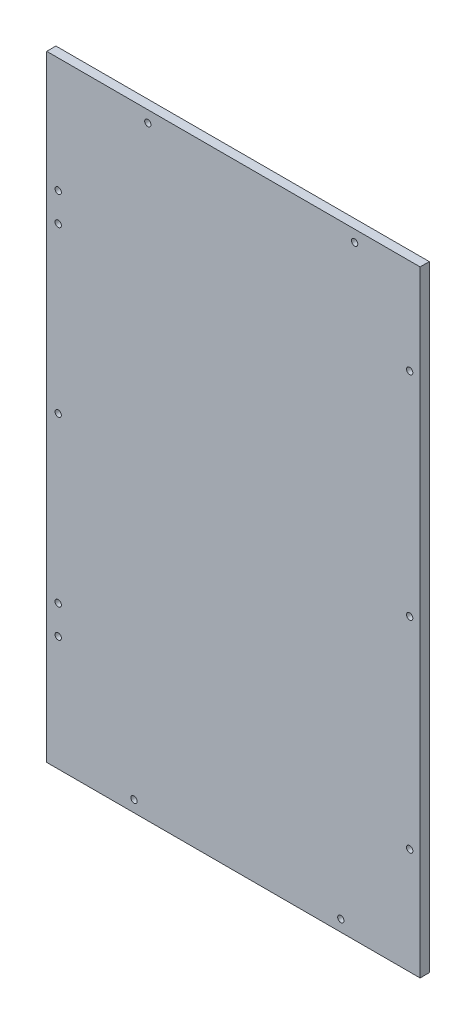
ISO-10303-21;
HEADER;
FILE_DESCRIPTION(('STEP AP214'),'2;1');
FILE_NAME('part.step','',(''),(''),'','','');
FILE_SCHEMA(('AUTOMOTIVE_DESIGN { 1 0 10303 214 1 1 1 1 }'));
ENDSEC;
DATA;
#1=APPLICATION_CONTEXT('core data for automotive mechanical design processes');
#2=APPLICATION_PROTOCOL_DEFINITION('international standard','automotive_design',2000,#1);
#3=PRODUCT_CONTEXT('',#1,'mechanical');
#4=PRODUCT('Part','Part','',(#3));
#5=PRODUCT_RELATED_PRODUCT_CATEGORY('part','',(#4));
#6=PRODUCT_DEFINITION_FORMATION('','',#4);
#7=PRODUCT_DEFINITION_CONTEXT('part definition',#1,'design');
#8=PRODUCT_DEFINITION('design','',#6,#7);
#9=PRODUCT_DEFINITION_SHAPE('','',#8);
#10=(LENGTH_UNIT() NAMED_UNIT(*) SI_UNIT(.MILLI.,.METRE.));
#11=(NAMED_UNIT(*) PLANE_ANGLE_UNIT() SI_UNIT($,.RADIAN.));
#12=(NAMED_UNIT(*) SI_UNIT($,.STERADIAN.) SOLID_ANGLE_UNIT());
#13=UNCERTAINTY_MEASURE_WITH_UNIT(LENGTH_MEASURE(1.E-05),#10,'distance_accuracy_value','');
#14=(GEOMETRIC_REPRESENTATION_CONTEXT(3) GLOBAL_UNCERTAINTY_ASSIGNED_CONTEXT((#13)) GLOBAL_UNIT_ASSIGNED_CONTEXT((#10,
#11,#12)) REPRESENTATION_CONTEXT('',''));
#15=CARTESIAN_POINT('',(0.,0.,0.));
#16=DIRECTION('',(0.,0.,1.));
#17=DIRECTION('',(1.,0.,0.));
#18=AXIS2_PLACEMENT_3D('',#15,#16,#17);
#19=CARTESIAN_POINT('',(0.,0.,8.));
#20=DIRECTION('',(0.,0.,1.));
#21=DIRECTION('',(1.,0.,0.));
#22=AXIS2_PLACEMENT_3D('',#19,#20,#21);
#23=PLANE('',#22);
#24=CARTESIAN_POINT('',(-257.999921927843,168.009529996844,8.));
#25=DIRECTION('',(0.,0.,1.));
#26=DIRECTION('',(1.,0.,0.));
#27=AXIS2_PLACEMENT_3D('',#24,#25,#26);
#28=CIRCLE('',#27,2.74999999999998);
#29=CARTESIAN_POINT('',(-255.249921927843,168.009529996844,8.));
#30=VERTEX_POINT('',#29);
#31=EDGE_CURVE('E169',#30,#30,#28,.T.);
#32=ORIENTED_EDGE('',*,*,#31,.F.);
#33=EDGE_LOOP('',(#32));
#34=FACE_BOUND('',#33,.T.);
#35=CARTESIAN_POINT('',(-257.999921927843,2.77555756156289E-12,8.));
#36=DIRECTION('',(0.,0.,1.));
#37=DIRECTION('',(1.,0.,0.));
#38=AXIS2_PLACEMENT_3D('',#35,#36,#37);
#39=CIRCLE('',#38,2.74999999999998);
#40=CARTESIAN_POINT('',(-255.249921927843,2.77555756156289E-12,8.));
#41=VERTEX_POINT('',#40);
#42=EDGE_CURVE('E157',#41,#41,#39,.T.);
#43=ORIENTED_EDGE('',*,*,#42,.F.);
#44=EDGE_LOOP('',(#43));
#45=FACE_BOUND('',#44,.T.);
#46=CARTESIAN_POINT('',(-12.0094519246867,-258.,8.));
#47=DIRECTION('',(0.,0.,1.));
#48=DIRECTION('',(1.,0.,0.));
#49=AXIS2_PLACEMENT_3D('',#46,#47,#48);
#50=CIRCLE('',#49,2.75);
#51=CARTESIAN_POINT('',(-9.25945192468669,-258.,8.));
#52=VERTEX_POINT('',#51);
#53=EDGE_CURVE('E145',#52,#52,#50,.T.);
#54=ORIENTED_EDGE('',*,*,#53,.F.);
#55=EDGE_LOOP('',(#54));
#56=FACE_BOUND('',#55,.T.);
#57=CARTESIAN_POINT('',(47.9399873337863,185.031928086976,8.));
#58=DIRECTION('',(0.,0.,1.));
#59=DIRECTION('',(1.,0.,0.));
#60=AXIS2_PLACEMENT_3D('',#57,#58,#59);
#61=CIRCLE('',#60,2.75);
#62=CARTESIAN_POINT('',(50.6899873337863,185.031928086976,8.));
#63=VERTEX_POINT('',#62);
#64=EDGE_CURVE('E133',#63,#63,#61,.T.);
#65=ORIENTED_EDGE('',*,*,#64,.F.);
#66=EDGE_LOOP('',(#65));
#67=FACE_BOUND('',#66,.T.);
#68=CARTESIAN_POINT('',(-257.999921927843,143.009529996844,8.));
#69=DIRECTION('',(0.,0.,1.));
#70=DIRECTION('',(1.,0.,0.));
#71=AXIS2_PLACEMENT_3D('',#68,#69,#70);
#72=CIRCLE('',#71,2.74999992222223);
#73=CARTESIAN_POINT('',(-255.249922005621,143.009529996844,8.));
#74=VERTEX_POINT('',#73);
#75=EDGE_CURVE('E121',#74,#74,#72,.T.);
#76=ORIENTED_EDGE('',*,*,#75,.F.);
#77=EDGE_LOOP('',(#76));
#78=FACE_BOUND('',#77,.T.);
#79=CARTESIAN_POINT('',(0.,258.,8.));
#80=DIRECTION('',(0.,0.,1.));
#81=DIRECTION('',(1.,0.,0.));
#82=AXIS2_PLACEMENT_3D('',#79,#80,#81);
#83=CIRCLE('',#82,2.75);
#84=CARTESIAN_POINT('',(2.74999999999994,258.,8.));
#85=VERTEX_POINT('',#84);
#86=EDGE_CURVE('E100',#85,#85,#83,.T.);
#87=ORIENTED_EDGE('',*,*,#86,.F.);
#88=EDGE_LOOP('',(#87));
#89=FACE_BOUND('',#88,.T.);
#90=DIRECTION('',(0.,-1.,0.));
#91=VECTOR('',#90,1.);
#92=CARTESIAN_POINT('',(-268.,268.,8.));
#93=LINE('',#92,#91);
#94=CARTESIAN_POINT('',(-268.,268.,8.));
#95=VERTEX_POINT('',#94);
#96=CARTESIAN_POINT('',(-268.,-268.,8.));
#97=VERTEX_POINT('',#96);
#98=EDGE_CURVE('E85',#95,#97,#93,.T.);
#99=ORIENTED_EDGE('',*,*,#98,.T.);
#100=DIRECTION('',(1.,0.,0.));
#101=VECTOR('',#100,1.);
#102=CARTESIAN_POINT('',(-268.,-268.,8.));
#103=LINE('',#102,#101);
#104=CARTESIAN_POINT('',(57.0000003952373,-267.999999999996,8.));
#105=VERTEX_POINT('',#104);
#106=EDGE_CURVE('E80',#97,#105,#103,.T.);
#107=ORIENTED_EDGE('',*,*,#106,.T.);
#108=DIRECTION('',(0.,1.,0.));
#109=VECTOR('',#108,1.);
#110=CARTESIAN_POINT('',(57.0000003952409,268.000000000005,8.));
#111=LINE('',#110,#109);
#112=CARTESIAN_POINT('',(57.0000003952409,268.000000000005,8.));
#113=VERTEX_POINT('',#112);
#114=EDGE_CURVE('E83',#105,#113,#111,.T.);
#115=ORIENTED_EDGE('',*,*,#114,.T.);
#116=DIRECTION('',(-1.,0.,0.));
#117=VECTOR('',#116,1.);
#118=CARTESIAN_POINT('',(-268.,268.,8.));
#119=LINE('',#118,#117);
#120=EDGE_CURVE('E50',#113,#95,#119,.T.);
#121=ORIENTED_EDGE('',*,*,#120,.T.);
#122=EDGE_LOOP('',(#99,#107,#115,#121));
#123=FACE_BOUND('',#122,.T.);
#124=CARTESIAN_POINT('',(-180.,258.,8.));
#125=DIRECTION('',(0.,0.,1.));
#126=DIRECTION('',(1.,0.,0.));
#127=AXIS2_PLACEMENT_3D('',#124,#125,#126);
#128=CIRCLE('',#127,2.75000000000001);
#129=CARTESIAN_POINT('',(-177.25,258.,8.));
#130=VERTEX_POINT('',#129);
#131=EDGE_CURVE('E115',#130,#130,#128,.T.);
#132=ORIENTED_EDGE('',*,*,#131,.F.);
#133=EDGE_LOOP('',(#132));
#134=FACE_BOUND('',#133,.T.);
#135=CARTESIAN_POINT('',(47.9399873337851,2.77555756156289E-12,8.));
#136=DIRECTION('',(0.,0.,1.));
#137=DIRECTION('',(1.,0.,0.));
#138=AXIS2_PLACEMENT_3D('',#135,#136,#137);
#139=CIRCLE('',#138,2.74999999999998);
#140=CARTESIAN_POINT('',(50.6899873337851,2.77555756156289E-12,8.));
#141=VERTEX_POINT('',#140);
#142=EDGE_CURVE('E127',#141,#141,#139,.T.);
#143=ORIENTED_EDGE('',*,*,#142,.F.);
#144=EDGE_LOOP('',(#143));
#145=FACE_BOUND('',#144,.T.);
#146=CARTESIAN_POINT('',(47.9399873337839,-175.453286577495,8.));
#147=DIRECTION('',(0.,0.,1.));
#148=DIRECTION('',(1.,0.,0.));
#149=AXIS2_PLACEMENT_3D('',#146,#147,#148);
#150=CIRCLE('',#149,2.74999999999998);
#151=CARTESIAN_POINT('',(50.6899873337839,-175.453286577495,8.));
#152=VERTEX_POINT('',#151);
#153=EDGE_CURVE('E139',#152,#152,#150,.T.);
#154=ORIENTED_EDGE('',*,*,#153,.F.);
#155=EDGE_LOOP('',(#154));
#156=FACE_BOUND('',#155,.T.);
#157=CARTESIAN_POINT('',(-192.009451924687,-258.,8.));
#158=DIRECTION('',(0.,0.,1.));
#159=DIRECTION('',(1.,0.,0.));
#160=AXIS2_PLACEMENT_3D('',#157,#158,#159);
#161=CIRCLE('',#160,2.75000000000001);
#162=CARTESIAN_POINT('',(-189.259451924687,-258.,8.));
#163=VERTEX_POINT('',#162);
#164=EDGE_CURVE('E151',#163,#163,#161,.T.);
#165=ORIENTED_EDGE('',*,*,#164,.F.);
#166=EDGE_LOOP('',(#165));
#167=FACE_BOUND('',#166,.T.);
#168=CARTESIAN_POINT('',(-257.999921927843,-167.990470003156,8.));
#169=DIRECTION('',(0.,0.,1.));
#170=DIRECTION('',(1.,0.,0.));
#171=AXIS2_PLACEMENT_3D('',#168,#169,#170);
#172=CIRCLE('',#171,2.74999999999998);
#173=CARTESIAN_POINT('',(-255.249921927843,-167.990470003156,8.));
#174=VERTEX_POINT('',#173);
#175=EDGE_CURVE('E163',#174,#174,#172,.T.);
#176=ORIENTED_EDGE('',*,*,#175,.F.);
#177=EDGE_LOOP('',(#176));
#178=FACE_BOUND('',#177,.T.);
#179=CARTESIAN_POINT('',(-257.999921927843,-142.9904717484,8.));
#180=DIRECTION('',(0.,0.,1.));
#181=DIRECTION('',(1.,0.,0.));
#182=AXIS2_PLACEMENT_3D('',#179,#180,#181);
#183=CIRCLE('',#182,2.74999989629094);
#184=CARTESIAN_POINT('',(-255.249922031552,-142.9904717484,8.));
#185=VERTEX_POINT('',#184);
#186=EDGE_CURVE('E175',#185,#185,#183,.T.);
#187=ORIENTED_EDGE('',*,*,#186,.F.);
#188=EDGE_LOOP('',(#187));
#189=FACE_BOUND('',#188,.T.);
#190=ADVANCED_FACE('F33',(#34,#45,#56,#67,#78,#89,#123,#134,#145,#156,#167,#178,#189),#23,.T.);
#191=CARTESIAN_POINT('',(0.,0.,0.));
#192=DIRECTION('',(0.,0.,1.));
#193=DIRECTION('',(1.,0.,0.));
#194=AXIS2_PLACEMENT_3D('',#191,#192,#193);
#195=PLANE('',#194);
#196=DIRECTION('',(0.,-1.,0.));
#197=VECTOR('',#196,1.);
#198=CARTESIAN_POINT('',(-268.,268.,0.));
#199=LINE('',#198,#197);
#200=CARTESIAN_POINT('',(-268.,268.,0.));
#201=VERTEX_POINT('',#200);
#202=CARTESIAN_POINT('',(-268.,-268.,0.));
#203=VERTEX_POINT('',#202);
#204=EDGE_CURVE('E97',#201,#203,#199,.T.);
#205=ORIENTED_EDGE('',*,*,#204,.F.);
#206=DIRECTION('',(-1.,0.,0.));
#207=VECTOR('',#206,1.);
#208=CARTESIAN_POINT('',(-268.,268.,0.));
#209=LINE('',#208,#207);
#210=CARTESIAN_POINT('',(57.0000003952409,268.000000000005,0.));
#211=VERTEX_POINT('',#210);
#212=EDGE_CURVE('E73',#211,#201,#209,.T.);
#213=ORIENTED_EDGE('',*,*,#212,.F.);
#214=DIRECTION('',(0.,1.,0.));
#215=VECTOR('',#214,1.);
#216=CARTESIAN_POINT('',(57.0000003952409,268.000000000005,0.));
#217=LINE('',#216,#215);
#218=CARTESIAN_POINT('',(57.0000003952373,-267.999999999996,0.));
#219=VERTEX_POINT('',#218);
#220=EDGE_CURVE('E67',#219,#211,#217,.T.);
#221=ORIENTED_EDGE('',*,*,#220,.F.);
#222=DIRECTION('',(1.,0.,0.));
#223=VECTOR('',#222,1.);
#224=CARTESIAN_POINT('',(-268.,-268.,0.));
#225=LINE('',#224,#223);
#226=EDGE_CURVE('E89',#203,#219,#225,.T.);
#227=ORIENTED_EDGE('',*,*,#226,.F.);
#228=EDGE_LOOP('',(#205,#213,#221,#227));
#229=FACE_BOUND('',#228,.T.);
#230=CARTESIAN_POINT('',(0.,258.,0.));
#231=DIRECTION('',(0.,0.,1.));
#232=DIRECTION('',(1.,0.,0.));
#233=AXIS2_PLACEMENT_3D('',#230,#231,#232);
#234=CIRCLE('',#233,2.75);
#235=CARTESIAN_POINT('',(2.74999999999994,258.,0.));
#236=VERTEX_POINT('',#235);
#237=EDGE_CURVE('E112',#236,#236,#234,.T.);
#238=ORIENTED_EDGE('',*,*,#237,.T.);
#239=EDGE_LOOP('',(#238));
#240=FACE_BOUND('',#239,.T.);
#241=CARTESIAN_POINT('',(-180.,258.,0.));
#242=DIRECTION('',(0.,0.,1.));
#243=DIRECTION('',(1.,0.,0.));
#244=AXIS2_PLACEMENT_3D('',#241,#242,#243);
#245=CIRCLE('',#244,2.75000000000001);
#246=CARTESIAN_POINT('',(-177.25,258.,0.));
#247=VERTEX_POINT('',#246);
#248=EDGE_CURVE('E118',#247,#247,#245,.T.);
#249=ORIENTED_EDGE('',*,*,#248,.T.);
#250=EDGE_LOOP('',(#249));
#251=FACE_BOUND('',#250,.T.);
#252=CARTESIAN_POINT('',(-257.999921927843,143.009529996844,0.));
#253=DIRECTION('',(0.,0.,1.));
#254=DIRECTION('',(1.,0.,0.));
#255=AXIS2_PLACEMENT_3D('',#252,#253,#254);
#256=CIRCLE('',#255,2.74999992222223);
#257=CARTESIAN_POINT('',(-255.249922005621,143.009529996844,0.));
#258=VERTEX_POINT('',#257);
#259=EDGE_CURVE('E124',#258,#258,#256,.T.);
#260=ORIENTED_EDGE('',*,*,#259,.T.);
#261=EDGE_LOOP('',(#260));
#262=FACE_BOUND('',#261,.T.);
#263=CARTESIAN_POINT('',(47.9399873337851,2.77555756156289E-12,0.));
#264=DIRECTION('',(0.,0.,1.));
#265=DIRECTION('',(1.,0.,0.));
#266=AXIS2_PLACEMENT_3D('',#263,#264,#265);
#267=CIRCLE('',#266,2.74999999999998);
#268=CARTESIAN_POINT('',(50.6899873337851,2.77555756156289E-12,0.));
#269=VERTEX_POINT('',#268);
#270=EDGE_CURVE('E130',#269,#269,#267,.T.);
#271=ORIENTED_EDGE('',*,*,#270,.T.);
#272=EDGE_LOOP('',(#271));
#273=FACE_BOUND('',#272,.T.);
#274=CARTESIAN_POINT('',(47.9399873337863,185.031928086976,0.));
#275=DIRECTION('',(0.,0.,1.));
#276=DIRECTION('',(1.,0.,0.));
#277=AXIS2_PLACEMENT_3D('',#274,#275,#276);
#278=CIRCLE('',#277,2.75);
#279=CARTESIAN_POINT('',(50.6899873337863,185.031928086976,0.));
#280=VERTEX_POINT('',#279);
#281=EDGE_CURVE('E136',#280,#280,#278,.T.);
#282=ORIENTED_EDGE('',*,*,#281,.T.);
#283=EDGE_LOOP('',(#282));
#284=FACE_BOUND('',#283,.T.);
#285=CARTESIAN_POINT('',(47.9399873337839,-175.453286577495,0.));
#286=DIRECTION('',(0.,0.,1.));
#287=DIRECTION('',(1.,0.,0.));
#288=AXIS2_PLACEMENT_3D('',#285,#286,#287);
#289=CIRCLE('',#288,2.74999999999998);
#290=CARTESIAN_POINT('',(50.6899873337839,-175.453286577495,0.));
#291=VERTEX_POINT('',#290);
#292=EDGE_CURVE('E142',#291,#291,#289,.T.);
#293=ORIENTED_EDGE('',*,*,#292,.T.);
#294=EDGE_LOOP('',(#293));
#295=FACE_BOUND('',#294,.T.);
#296=CARTESIAN_POINT('',(-12.0094519246867,-258.,0.));
#297=DIRECTION('',(0.,0.,1.));
#298=DIRECTION('',(1.,0.,0.));
#299=AXIS2_PLACEMENT_3D('',#296,#297,#298);
#300=CIRCLE('',#299,2.75);
#301=CARTESIAN_POINT('',(-9.25945192468669,-258.,0.));
#302=VERTEX_POINT('',#301);
#303=EDGE_CURVE('E148',#302,#302,#300,.T.);
#304=ORIENTED_EDGE('',*,*,#303,.T.);
#305=EDGE_LOOP('',(#304));
#306=FACE_BOUND('',#305,.T.);
#307=CARTESIAN_POINT('',(-192.009451924687,-258.,0.));
#308=DIRECTION('',(0.,0.,1.));
#309=DIRECTION('',(1.,0.,0.));
#310=AXIS2_PLACEMENT_3D('',#307,#308,#309);
#311=CIRCLE('',#310,2.75000000000001);
#312=CARTESIAN_POINT('',(-189.259451924687,-258.,0.));
#313=VERTEX_POINT('',#312);
#314=EDGE_CURVE('E154',#313,#313,#311,.T.);
#315=ORIENTED_EDGE('',*,*,#314,.T.);
#316=EDGE_LOOP('',(#315));
#317=FACE_BOUND('',#316,.T.);
#318=CARTESIAN_POINT('',(-257.999921927843,2.77555756156289E-12,0.));
#319=DIRECTION('',(0.,0.,1.));
#320=DIRECTION('',(1.,0.,0.));
#321=AXIS2_PLACEMENT_3D('',#318,#319,#320);
#322=CIRCLE('',#321,2.74999999999998);
#323=CARTESIAN_POINT('',(-255.249921927843,2.77555756156289E-12,0.));
#324=VERTEX_POINT('',#323);
#325=EDGE_CURVE('E160',#324,#324,#322,.T.);
#326=ORIENTED_EDGE('',*,*,#325,.T.);
#327=EDGE_LOOP('',(#326));
#328=FACE_BOUND('',#327,.T.);
#329=CARTESIAN_POINT('',(-257.999921927843,-167.990470003156,0.));
#330=DIRECTION('',(0.,0.,1.));
#331=DIRECTION('',(1.,0.,0.));
#332=AXIS2_PLACEMENT_3D('',#329,#330,#331);
#333=CIRCLE('',#332,2.74999999999998);
#334=CARTESIAN_POINT('',(-255.249921927843,-167.990470003156,0.));
#335=VERTEX_POINT('',#334);
#336=EDGE_CURVE('E166',#335,#335,#333,.T.);
#337=ORIENTED_EDGE('',*,*,#336,.T.);
#338=EDGE_LOOP('',(#337));
#339=FACE_BOUND('',#338,.T.);
#340=CARTESIAN_POINT('',(-257.999921927843,168.009529996844,0.));
#341=DIRECTION('',(0.,0.,1.));
#342=DIRECTION('',(1.,0.,0.));
#343=AXIS2_PLACEMENT_3D('',#340,#341,#342);
#344=CIRCLE('',#343,2.74999999999998);
#345=CARTESIAN_POINT('',(-255.249921927843,168.009529996844,0.));
#346=VERTEX_POINT('',#345);
#347=EDGE_CURVE('E172',#346,#346,#344,.T.);
#348=ORIENTED_EDGE('',*,*,#347,.T.);
#349=EDGE_LOOP('',(#348));
#350=FACE_BOUND('',#349,.T.);
#351=CARTESIAN_POINT('',(-257.999921927843,-142.9904717484,0.));
#352=DIRECTION('',(0.,0.,1.));
#353=DIRECTION('',(1.,0.,0.));
#354=AXIS2_PLACEMENT_3D('',#351,#352,#353);
#355=CIRCLE('',#354,2.74999989629094);
#356=CARTESIAN_POINT('',(-255.249922031552,-142.9904717484,0.));
#357=VERTEX_POINT('',#356);
#358=EDGE_CURVE('E178',#357,#357,#355,.T.);
#359=ORIENTED_EDGE('',*,*,#358,.T.);
#360=EDGE_LOOP('',(#359));
#361=FACE_BOUND('',#360,.T.);
#362=ADVANCED_FACE('F108',(#229,#240,#251,#262,#273,#284,#295,#306,#317,#328,#339,#350,#361),
#195,.F.);
#363=CARTESIAN_POINT('',(-268.,268.,8.));
#364=DIRECTION('',(1.,0.,0.));
#365=DIRECTION('',(0.,1.,0.));
#366=AXIS2_PLACEMENT_3D('',#363,#364,#365);
#367=PLANE('',#366);
#368=ORIENTED_EDGE('',*,*,#204,.T.);
#369=DIRECTION('',(0.,0.,-1.));
#370=VECTOR('',#369,1.);
#371=CARTESIAN_POINT('',(-268.,-268.,8.));
#372=LINE('',#371,#370);
#373=EDGE_CURVE('E11',#97,#203,#372,.T.);
#374=ORIENTED_EDGE('',*,*,#373,.F.);
#375=ORIENTED_EDGE('',*,*,#98,.F.);
#376=DIRECTION('',(0.,0.,-1.));
#377=VECTOR('',#376,1.);
#378=CARTESIAN_POINT('',(-268.,268.,8.));
#379=LINE('',#378,#377);
#380=EDGE_CURVE('E93',#95,#201,#379,.T.);
#381=ORIENTED_EDGE('',*,*,#380,.T.);
#382=EDGE_LOOP('',(#368,#374,#375,#381));
#383=FACE_BOUND('',#382,.T.);
#384=ADVANCED_FACE('F35',(#383),#367,.F.);
#385=CARTESIAN_POINT('',(-268.,-268.,8.));
#386=DIRECTION('',(0.,1.,0.));
#387=DIRECTION('',(-1.,0.,0.));
#388=AXIS2_PLACEMENT_3D('',#385,#386,#387);
#389=PLANE('',#388);
#390=ORIENTED_EDGE('',*,*,#226,.T.);
#391=DIRECTION('',(0.,0.,-1.));
#392=VECTOR('',#391,1.);
#393=CARTESIAN_POINT('',(57.0000003952373,-267.999999999996,8.));
#394=LINE('',#393,#392);
#395=EDGE_CURVE('E42',#105,#219,#394,.T.);
#396=ORIENTED_EDGE('',*,*,#395,.F.);
#397=ORIENTED_EDGE('',*,*,#106,.F.);
#398=ORIENTED_EDGE('',*,*,#373,.T.);
#399=EDGE_LOOP('',(#390,#396,#397,#398));
#400=FACE_BOUND('',#399,.T.);
#401=ADVANCED_FACE('F88',(#400),#389,.F.);
#402=CARTESIAN_POINT('',(57.0000003952409,268.000000000005,8.));
#403=DIRECTION('',(-1.,0.,0.));
#404=DIRECTION('',(0.,-1.,0.));
#405=AXIS2_PLACEMENT_3D('',#402,#403,#404);
#406=PLANE('',#405);
#407=ORIENTED_EDGE('',*,*,#220,.T.);
#408=DIRECTION('',(0.,0.,-1.));
#409=VECTOR('',#408,1.);
#410=CARTESIAN_POINT('',(57.0000003952409,268.000000000005,8.));
#411=LINE('',#410,#409);
#412=EDGE_CURVE('E90',#113,#211,#411,.T.);
#413=ORIENTED_EDGE('',*,*,#412,.F.);
#414=ORIENTED_EDGE('',*,*,#114,.F.);
#415=ORIENTED_EDGE('',*,*,#395,.T.);
#416=EDGE_LOOP('',(#407,#413,#414,#415));
#417=FACE_BOUND('',#416,.T.);
#418=ADVANCED_FACE('F91',(#417),#406,.F.);
#419=CARTESIAN_POINT('',(-268.,268.,8.));
#420=DIRECTION('',(0.,-1.,0.));
#421=DIRECTION('',(1.,0.,0.));
#422=AXIS2_PLACEMENT_3D('',#419,#420,#421);
#423=PLANE('',#422);
#424=ORIENTED_EDGE('',*,*,#212,.T.);
#425=ORIENTED_EDGE('',*,*,#380,.F.);
#426=ORIENTED_EDGE('',*,*,#120,.F.);
#427=ORIENTED_EDGE('',*,*,#412,.T.);
#428=EDGE_LOOP('',(#424,#425,#426,#427));
#429=FACE_BOUND('',#428,.T.);
#430=ADVANCED_FACE('F105',(#429),#423,.F.);
#431=CARTESIAN_POINT('',(0.,258.,8.));
#432=DIRECTION('',(0.,0.,-1.));
#433=DIRECTION('',(-1.,0.,0.));
#434=AXIS2_PLACEMENT_3D('',#431,#432,#433);
#435=CYLINDRICAL_SURFACE('',#434,2.75);
#436=ORIENTED_EDGE('',*,*,#86,.T.);
#437=EDGE_LOOP('',(#436));
#438=FACE_BOUND('',#437,.T.);
#439=ORIENTED_EDGE('',*,*,#237,.F.);
#440=EDGE_LOOP('',(#439));
#441=FACE_BOUND('',#440,.T.);
#442=ADVANCED_FACE('F197',(#438,#441),#435,.F.);
#443=CARTESIAN_POINT('',(-180.,258.,8.));
#444=DIRECTION('',(0.,0.,-1.));
#445=DIRECTION('',(-1.,0.,0.));
#446=AXIS2_PLACEMENT_3D('',#443,#444,#445);
#447=CYLINDRICAL_SURFACE('',#446,2.75000000000001);
#448=ORIENTED_EDGE('',*,*,#131,.T.);
#449=EDGE_LOOP('',(#448));
#450=FACE_BOUND('',#449,.T.);
#451=ORIENTED_EDGE('',*,*,#248,.F.);
#452=EDGE_LOOP('',(#451));
#453=FACE_BOUND('',#452,.T.);
#454=ADVANCED_FACE('F243',(#450,#453),#447,.F.);
#455=CARTESIAN_POINT('',(-257.999921927843,143.009529996844,8.));
#456=DIRECTION('',(0.,0.,-1.));
#457=DIRECTION('',(-1.,0.,0.));
#458=AXIS2_PLACEMENT_3D('',#455,#456,#457);
#459=CYLINDRICAL_SURFACE('',#458,2.74999992222223);
#460=ORIENTED_EDGE('',*,*,#75,.T.);
#461=EDGE_LOOP('',(#460));
#462=FACE_BOUND('',#461,.T.);
#463=ORIENTED_EDGE('',*,*,#259,.F.);
#464=EDGE_LOOP('',(#463));
#465=FACE_BOUND('',#464,.T.);
#466=ADVANCED_FACE('F251',(#462,#465),#459,.F.);
#467=CARTESIAN_POINT('',(47.9399873337851,2.77555756156289E-12,8.));
#468=DIRECTION('',(0.,0.,-1.));
#469=DIRECTION('',(-1.,0.,0.));
#470=AXIS2_PLACEMENT_3D('',#467,#468,#469);
#471=CYLINDRICAL_SURFACE('',#470,2.74999999999998);
#472=ORIENTED_EDGE('',*,*,#142,.T.);
#473=EDGE_LOOP('',(#472));
#474=FACE_BOUND('',#473,.T.);
#475=ORIENTED_EDGE('',*,*,#270,.F.);
#476=EDGE_LOOP('',(#475));
#477=FACE_BOUND('',#476,.T.);
#478=ADVANCED_FACE('F259',(#474,#477),#471,.F.);
#479=CARTESIAN_POINT('',(47.9399873337863,185.031928086976,8.));
#480=DIRECTION('',(0.,0.,-1.));
#481=DIRECTION('',(-1.,0.,0.));
#482=AXIS2_PLACEMENT_3D('',#479,#480,#481);
#483=CYLINDRICAL_SURFACE('',#482,2.75);
#484=ORIENTED_EDGE('',*,*,#64,.T.);
#485=EDGE_LOOP('',(#484));
#486=FACE_BOUND('',#485,.T.);
#487=ORIENTED_EDGE('',*,*,#281,.F.);
#488=EDGE_LOOP('',(#487));
#489=FACE_BOUND('',#488,.T.);
#490=ADVANCED_FACE('F268',(#486,#489),#483,.F.);
#491=CARTESIAN_POINT('',(47.9399873337839,-175.453286577495,8.));
#492=DIRECTION('',(0.,0.,-1.));
#493=DIRECTION('',(-1.,0.,0.));
#494=AXIS2_PLACEMENT_3D('',#491,#492,#493);
#495=CYLINDRICAL_SURFACE('',#494,2.74999999999998);
#496=ORIENTED_EDGE('',*,*,#153,.T.);
#497=EDGE_LOOP('',(#496));
#498=FACE_BOUND('',#497,.T.);
#499=ORIENTED_EDGE('',*,*,#292,.F.);
#500=EDGE_LOOP('',(#499));
#501=FACE_BOUND('',#500,.T.);
#502=ADVANCED_FACE('F277',(#498,#501),#495,.F.);
#503=CARTESIAN_POINT('',(-12.0094519246867,-258.,8.));
#504=DIRECTION('',(0.,0.,-1.));
#505=DIRECTION('',(-1.,0.,0.));
#506=AXIS2_PLACEMENT_3D('',#503,#504,#505);
#507=CYLINDRICAL_SURFACE('',#506,2.75);
#508=ORIENTED_EDGE('',*,*,#53,.T.);
#509=EDGE_LOOP('',(#508));
#510=FACE_BOUND('',#509,.T.);
#511=ORIENTED_EDGE('',*,*,#303,.F.);
#512=EDGE_LOOP('',(#511));
#513=FACE_BOUND('',#512,.T.);
#514=ADVANCED_FACE('F286',(#510,#513),#507,.F.);
#515=CARTESIAN_POINT('',(-192.009451924687,-258.,8.));
#516=DIRECTION('',(0.,0.,-1.));
#517=DIRECTION('',(-1.,0.,0.));
#518=AXIS2_PLACEMENT_3D('',#515,#516,#517);
#519=CYLINDRICAL_SURFACE('',#518,2.75000000000001);
#520=ORIENTED_EDGE('',*,*,#164,.T.);
#521=EDGE_LOOP('',(#520));
#522=FACE_BOUND('',#521,.T.);
#523=ORIENTED_EDGE('',*,*,#314,.F.);
#524=EDGE_LOOP('',(#523));
#525=FACE_BOUND('',#524,.T.);
#526=ADVANCED_FACE('F295',(#522,#525),#519,.F.);
#527=CARTESIAN_POINT('',(-257.999921927843,2.77555756156289E-12,8.));
#528=DIRECTION('',(0.,0.,-1.));
#529=DIRECTION('',(-1.,0.,0.));
#530=AXIS2_PLACEMENT_3D('',#527,#528,#529);
#531=CYLINDRICAL_SURFACE('',#530,2.74999999999998);
#532=ORIENTED_EDGE('',*,*,#42,.T.);
#533=EDGE_LOOP('',(#532));
#534=FACE_BOUND('',#533,.T.);
#535=ORIENTED_EDGE('',*,*,#325,.F.);
#536=EDGE_LOOP('',(#535));
#537=FACE_BOUND('',#536,.T.);
#538=ADVANCED_FACE('F304',(#534,#537),#531,.F.);
#539=CARTESIAN_POINT('',(-257.999921927843,-167.990470003156,8.));
#540=DIRECTION('',(0.,0.,-1.));
#541=DIRECTION('',(-1.,0.,0.));
#542=AXIS2_PLACEMENT_3D('',#539,#540,#541);
#543=CYLINDRICAL_SURFACE('',#542,2.74999999999998);
#544=ORIENTED_EDGE('',*,*,#175,.T.);
#545=EDGE_LOOP('',(#544));
#546=FACE_BOUND('',#545,.T.);
#547=ORIENTED_EDGE('',*,*,#336,.F.);
#548=EDGE_LOOP('',(#547));
#549=FACE_BOUND('',#548,.T.);
#550=ADVANCED_FACE('F313',(#546,#549),#543,.F.);
#551=CARTESIAN_POINT('',(-257.999921927843,168.009529996844,8.));
#552=DIRECTION('',(0.,0.,-1.));
#553=DIRECTION('',(-1.,0.,0.));
#554=AXIS2_PLACEMENT_3D('',#551,#552,#553);
#555=CYLINDRICAL_SURFACE('',#554,2.74999999999998);
#556=ORIENTED_EDGE('',*,*,#31,.T.);
#557=EDGE_LOOP('',(#556));
#558=FACE_BOUND('',#557,.T.);
#559=ORIENTED_EDGE('',*,*,#347,.F.);
#560=EDGE_LOOP('',(#559));
#561=FACE_BOUND('',#560,.T.);
#562=ADVANCED_FACE('F322',(#558,#561),#555,.F.);
#563=CARTESIAN_POINT('',(-257.999921927843,-142.9904717484,8.));
#564=DIRECTION('',(0.,0.,-1.));
#565=DIRECTION('',(-1.,0.,0.));
#566=AXIS2_PLACEMENT_3D('',#563,#564,#565);
#567=CYLINDRICAL_SURFACE('',#566,2.74999989629094);
#568=ORIENTED_EDGE('',*,*,#186,.T.);
#569=EDGE_LOOP('',(#568));
#570=FACE_BOUND('',#569,.T.);
#571=ORIENTED_EDGE('',*,*,#358,.F.);
#572=EDGE_LOOP('',(#571));
#573=FACE_BOUND('',#572,.T.);
#574=ADVANCED_FACE('F184',(#570,#573),#567,.F.);
#575=CLOSED_SHELL('',(#190,#362,#384,#401,#418,#430,#442,#454,#466,#478,#490,#502,#514,#526,
#538,#550,#562,#574));
#576=MANIFOLD_SOLID_BREP('B2',#575);
#577=ADVANCED_BREP_SHAPE_REPRESENTATION('',(#18,#576),#14);
#578=SHAPE_DEFINITION_REPRESENTATION(#9,#577);
ENDSEC;
END-ISO-10303-21;
